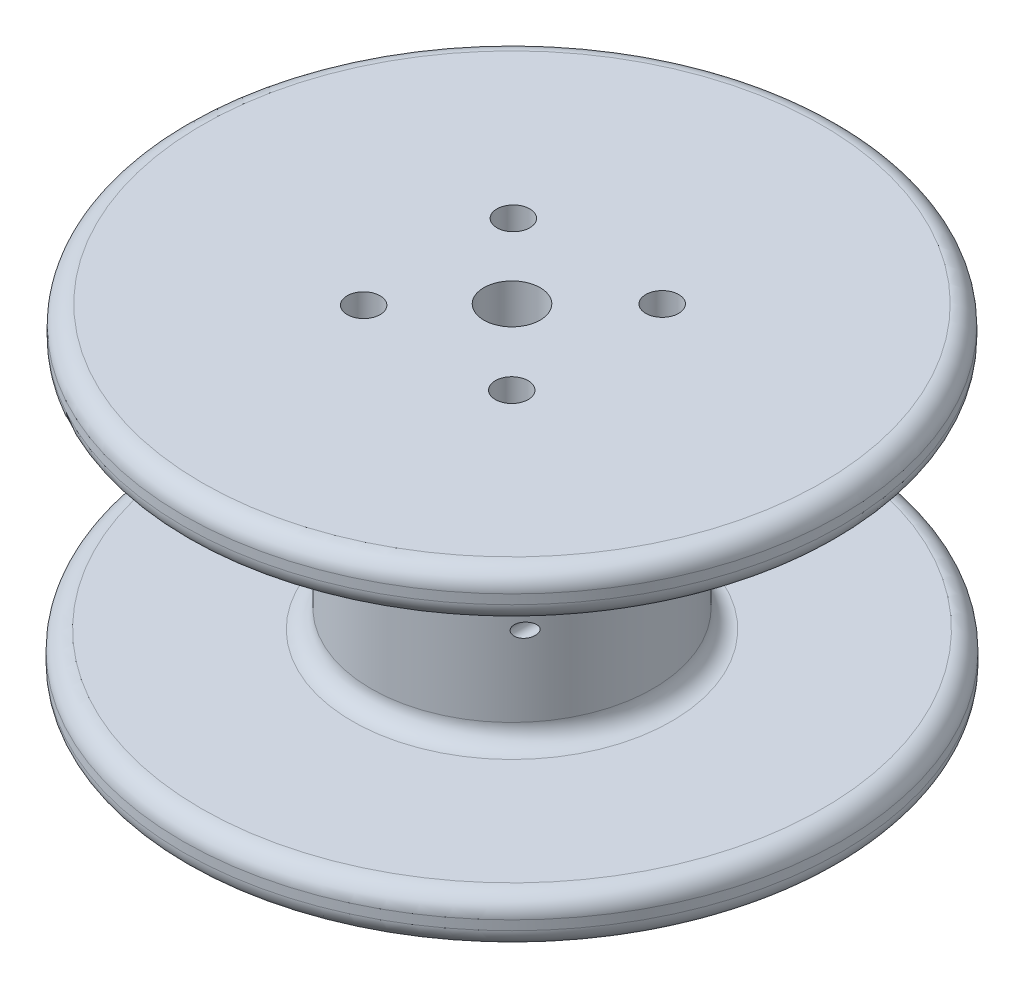
ISO-10303-21;
HEADER;
FILE_DESCRIPTION(('STEP AP214'),'2;1');
FILE_NAME('part.step','',(''),(''),'','','');
FILE_SCHEMA(('AUTOMOTIVE_DESIGN { 1 0 10303 214 1 1 1 1 }'));
ENDSEC;
DATA;
#1=APPLICATION_CONTEXT('core data for automotive mechanical design processes');
#2=APPLICATION_PROTOCOL_DEFINITION('international standard','automotive_design',2000,#1);
#3=PRODUCT_CONTEXT('',#1,'mechanical');
#4=PRODUCT('Part','Part','',(#3));
#5=PRODUCT_RELATED_PRODUCT_CATEGORY('part','',(#4));
#6=PRODUCT_DEFINITION_FORMATION('','',#4);
#7=PRODUCT_DEFINITION_CONTEXT('part definition',#1,'design');
#8=PRODUCT_DEFINITION('design','',#6,#7);
#9=PRODUCT_DEFINITION_SHAPE('','',#8);
#10=(LENGTH_UNIT() NAMED_UNIT(*) SI_UNIT(.MILLI.,.METRE.));
#11=(NAMED_UNIT(*) PLANE_ANGLE_UNIT() SI_UNIT($,.RADIAN.));
#12=(NAMED_UNIT(*) SI_UNIT($,.STERADIAN.) SOLID_ANGLE_UNIT());
#13=UNCERTAINTY_MEASURE_WITH_UNIT(LENGTH_MEASURE(1.E-05),#10,'distance_accuracy_value','');
#14=(GEOMETRIC_REPRESENTATION_CONTEXT(3) GLOBAL_UNCERTAINTY_ASSIGNED_CONTEXT((#13)) GLOBAL_UNIT_ASSIGNED_CONTEXT((#10,
#11,#12)) REPRESENTATION_CONTEXT('',''));
#15=CARTESIAN_POINT('',(0.,0.,0.));
#16=DIRECTION('',(0.,0.,1.));
#17=DIRECTION('',(1.,0.,0.));
#18=AXIS2_PLACEMENT_3D('',#15,#16,#17);
#19=CARTESIAN_POINT('',(5.3649767768147,5.8506792339153,18.7389255189844));
#20=DIRECTION('',(0.,-1.,0.));
#21=DIRECTION('',(0.,0.,-1.));
#22=AXIS2_PLACEMENT_3D('',#19,#20,#21);
#23=CYLINDRICAL_SURFACE('',#22,15.);
#24=CARTESIAN_POINT('',(5.3649767768147,-17.1493207660847,18.7389255189844));
#25=DIRECTION('',(0.,-1.,0.));
#26=DIRECTION('',(0.,0.,-1.));
#27=AXIS2_PLACEMENT_3D('',#24,#25,#26);
#28=CIRCLE('',#27,15.);
#29=CARTESIAN_POINT('',(5.3649767768147,-17.1493207660847,3.73892551898436));
#30=VERTEX_POINT('',#29);
#31=EDGE_CURVE('E184',#30,#30,#28,.F.);
#32=ORIENTED_EDGE('',*,*,#31,.T.);
#33=EDGE_LOOP('',(#32));
#34=FACE_BOUND('',#33,.T.);
#35=CARTESIAN_POINT('',(5.3649767768147,3.8506792339153,18.7389255189844));
#36=DIRECTION('',(0.,1.,0.));
#37=DIRECTION('',(0.,0.,1.));
#38=AXIS2_PLACEMENT_3D('',#35,#36,#37);
#39=CIRCLE('',#38,15.);
#40=CARTESIAN_POINT('',(5.3649767768147,3.8506792339153,33.7389255189844));
#41=VERTEX_POINT('',#40);
#42=EDGE_CURVE('E185',#41,#41,#39,.F.);
#43=ORIENTED_EDGE('',*,*,#42,.T.);
#44=EDGE_LOOP('',(#43));
#45=FACE_BOUND('',#44,.T.);
#46=CARTESIAN_POINT('',(15.8891790061136,-5.00544756114252,8.05055953363276));
#47=CARTESIAN_POINT('',(15.889181914113,-4.97207896366376,8.0505622129564));
#48=CARTESIAN_POINT('',(15.8914269025401,-4.93866534636372,8.05277146835095));
#49=CARTESIAN_POINT('',(15.900227494013,-4.87295012460581,8.06144791026443));
#50=CARTESIAN_POINT('',(15.906791922064,-4.84065093952129,8.06792381396596));
#51=CARTESIAN_POINT('',(15.9236696263763,-4.77833109047816,8.08462388748844));
#52=CARTESIAN_POINT('',(15.9339579814084,-4.74829684698665,8.09482314372935));
#53=CARTESIAN_POINT('',(15.9576416545049,-4.69084552581334,8.11839210874743));
#54=CARTESIAN_POINT('',(15.9710374993847,-4.66342889301108,8.13176235511392));
#55=CARTESIAN_POINT('',(16.0059428445912,-4.60144487306922,8.16676120387421));
#56=CARTESIAN_POINT('',(16.0285895404242,-4.56819437078488,8.18958657756171));
#57=CARTESIAN_POINT('',(16.0771619259344,-4.50728965864285,8.23891141509037));
#58=CARTESIAN_POINT('',(16.1030942650504,-4.47964710171958,8.26541834037338));
#59=CARTESIAN_POINT('',(16.1680171735549,-4.41963899082199,8.33232853820338));
#60=CARTESIAN_POINT('',(16.2080580404324,-4.38986064199597,8.37402657646971));
#61=CARTESIAN_POINT('',(16.290314662803,-4.33977614092461,8.46076442132177));
#62=CARTESIAN_POINT('',(16.3325337968752,-4.31948522632493,8.50580946996783));
#63=CARTESIAN_POINT('',(16.4337826032726,-4.2814083953156,8.61524310088077));
#64=CARTESIAN_POINT('',(16.4932052238639,-4.26738407286036,8.68057637237535));
#65=CARTESIAN_POINT('',(16.611612793469,-4.25358357386457,8.81314495350922));
#66=CARTESIAN_POINT('',(16.6705968753566,-4.25383056486331,8.88038317875259));
#67=CARTESIAN_POINT('',(16.7877923860102,-4.26790704690815,9.01640013228008));
#68=CARTESIAN_POINT('',(16.8459665081431,-4.2820004679154,9.085183399325));
#69=CARTESIAN_POINT('',(16.9589069028365,-4.32433724372592,9.22112430596214));
#70=CARTESIAN_POINT('',(17.0136796849919,-4.35255257058302,9.28828489043004));
#71=CARTESIAN_POINT('',(17.0971452947202,-4.41028731406759,9.39233460761359));
#72=CARTESIAN_POINT('',(17.1275455371407,-4.43482346703795,9.43063833024556));
#73=CARTESIAN_POINT('',(17.1857054579592,-4.49025559490618,9.50461089881965));
#74=CARTESIAN_POINT('',(17.2134683301515,-4.52114373038625,9.54028291968301));
#75=CARTESIAN_POINT('',(17.2581348689766,-4.58073883998642,9.59815160479251));
#76=CARTESIAN_POINT('',(17.2759402713793,-4.60776090672559,9.62137725891237));
#77=CARTESIAN_POINT('',(17.3087619276177,-4.6659335117058,9.66441597670165));
#78=CARTESIAN_POINT('',(17.3237829929563,-4.69707676556146,9.68423492297748));
#79=CARTESIAN_POINT('',(17.3464952401759,-4.75466851305593,9.71432173790818));
#80=CARTESIAN_POINT('',(17.3550735230231,-4.78016553523352,9.72572815792618));
#81=CARTESIAN_POINT('',(17.3696319143169,-4.83313792480478,9.74512751606485));
#82=CARTESIAN_POINT('',(17.3756145180535,-4.8606113624618,9.75312373237151));
#83=CARTESIAN_POINT('',(17.3845230739808,-4.91719727159362,9.76504314570204));
#84=CARTESIAN_POINT('',(17.3874214722968,-4.9463221090957,9.76892962499699));
#85=CARTESIAN_POINT('',(17.3897513281692,-5.00495562950559,9.77205305193482));
#86=CARTESIAN_POINT('',(17.3891846682086,-5.0344640953033,9.77129252418526));
#87=CARTESIAN_POINT('',(17.3849495493304,-5.08897805849169,9.76561714742869));
#88=CARTESIAN_POINT('',(17.3816877824554,-5.11407611387994,9.76124701783209));
#89=CARTESIAN_POINT('',(17.3728455525928,-5.16310159720335,9.74942376484463));
#90=CARTESIAN_POINT('',(17.3672639671482,-5.18702845217378,9.7419691490159));
#91=CARTESIAN_POINT('',(17.351623992164,-5.24214561867459,9.72113676401826));
#92=CARTESIAN_POINT('',(17.3406702828367,-5.27263557921504,9.70658451705739));
#93=CARTESIAN_POINT('',(17.3159016390705,-5.33031227674946,9.67383760214363));
#94=CARTESIAN_POINT('',(17.3020803628239,-5.35749147667266,9.65563486392702));
#95=CARTESIAN_POINT('',(17.2646878638864,-5.42166757946784,9.60666198925528));
#96=CARTESIAN_POINT('',(17.2397442344635,-5.45658102523069,9.5742241198599));
#97=CARTESIAN_POINT('',(17.1866114340552,-5.51976807846141,9.50578663988002));
#98=CARTESIAN_POINT('',(17.1584150285737,-5.54802644303453,9.4697791160353));
#99=CARTESIAN_POINT('',(17.0836899885476,-5.61249681636343,9.37532184064214));
#100=CARTESIAN_POINT('',(17.0355587755206,-5.64462537101157,9.31535443219502));
#101=CARTESIAN_POINT('',(16.9358009409369,-5.69658874559832,9.19312551219416));
#102=CARTESIAN_POINT('',(16.8841698283418,-5.71640742525778,9.1308611016679));
#103=CARTESIAN_POINT('',(16.7766264226144,-5.74491693873943,9.00334855132304));
#104=CARTESIAN_POINT('',(16.7206262925954,-5.75316563559109,8.9380756797754));
#105=CARTESIAN_POINT('',(16.6073241736508,-5.75690945968884,8.80831480522619));
#106=CARTESIAN_POINT('',(16.5500230519735,-5.75241284898085,8.74382632097239));
#107=CARTESIAN_POINT('',(16.4450433491691,-5.73151981688938,8.62768381471077));
#108=CARTESIAN_POINT('',(16.397343793203,-5.71721893036029,8.57567392513898));
#109=CARTESIAN_POINT('',(16.3032771763167,-5.67795214676981,8.47450535630398));
#110=CARTESIAN_POINT('',(16.2569082711289,-5.6530018556048,8.4253426240042));
#111=CARTESIAN_POINT('',(16.1807692853111,-5.60027697964653,8.34562374689932));
#112=CARTESIAN_POINT('',(16.1501543589533,-5.57553373688251,8.31387305627028));
#113=CARTESIAN_POINT('',(16.091648401915,-5.51959070738875,8.25368521187922));
#114=CARTESIAN_POINT('',(16.0637534433809,-5.48840044016758,8.22524326819734));
#115=CARTESIAN_POINT('',(16.0182688628729,-5.42741652550454,8.17918302984812));
#116=CARTESIAN_POINT('',(15.9997985065512,-5.39901961302501,8.16059235628507));
#117=CARTESIAN_POINT('',(15.9662267182574,-5.33836202856874,8.12694816063829));
#118=CARTESIAN_POINT('',(15.9511222683046,-5.30610485804492,8.11189146922096));
#119=CARTESIAN_POINT('',(15.9274239737102,-5.2438286197896,8.08834138616769));
#120=CARTESIAN_POINT('',(15.9181673020813,-5.21431734357138,8.07917518187886));
#121=CARTESIAN_POINT('',(15.9032877950989,-5.15355665822734,8.06446476994967));
#122=CARTESIAN_POINT('',(15.8976565652987,-5.12231144760208,8.05891219488727));
#123=CARTESIAN_POINT('',(15.8924228488499,-5.07656389561166,8.05375433122965));
#124=CARTESIAN_POINT('',(15.8912090277514,-5.06239826286872,8.05255868748308));
#125=CARTESIAN_POINT('',(15.8895863947099,-5.03397369725734,8.05096062721514));
#126=CARTESIAN_POINT('',(15.8891777627601,-5.01971474424252,8.05055838805267));
#127=CARTESIAN_POINT('',(15.8891790061136,-5.00544756114252,8.05055953363276));
#128=B_SPLINE_CURVE_WITH_KNOTS('',3,(#46,#47,#48,#49,#50,#51,#52,#53,#54,#55,#56,#57,#58,#59,
#60,#61,#62,#63,#64,#65,#66,#67,#68,#69,#70,#71,#72,#73,#74,#75,#76,#77,#78,#79,#80,#81,#82,#83,
#84,#85,#86,#87,#88,#89,#90,#91,#92,#93,#94,#95,#96,#97,#98,#99,#100,#101,#102,#103,#104,#105,
#106,#107,#108,#109,#110,#111,#112,#113,#114,#115,#116,#117,#118,#119,#120,#121,#122,#123,#124,
#125,#126,#127),.UNSPECIFIED.,.T.,.F.,(4,2,2,2,2,2,2,2,2,2,2,2,2,2,2,2,2,2,2,2,2,2,2,2,2,2,2,2,
2,2,2,2,2,2,2,2,2,2,2,2,4),(0.,0.100041881431961,0.200288794759234,0.299876878229037,
0.399481857307535,0.537478203062803,0.675758423422499,0.869774809768873,1.06410174194843,
1.33095859465769,1.5982486653789,1.87073445139912,2.14268156289555,2.3064530726867,
2.47002366094672,2.58918193421083,2.7081323349891,2.79547495702423,2.88273342740119,
2.9707650715562,3.05874889448211,3.13546055551593,3.21220937720043,3.31816084621014,
3.42434918026893,3.58481892527648,3.7456527136925,3.99431490286966,4.24330244477831,
4.50156724296353,4.75966466131022,4.97499003522363,5.19000094364641,5.34125498321252,
5.49228726030966,5.60779897244409,5.723206692529,5.81958756312064,5.91574446050248,
5.95850912521557,6.00128334852439),.UNSPECIFIED.);
#129=CARTESIAN_POINT('',(15.8891790061136,-5.00544756114252,8.05055953363276));
#130=VERTEX_POINT('',#129);
#131=EDGE_CURVE('E59',#130,#130,#128,.T.);
#132=ORIENTED_EDGE('',*,*,#131,.F.);
#133=EDGE_LOOP('',(#132));
#134=FACE_BOUND('',#133,.T.);
#135=CARTESIAN_POINT('',(15.8891790061136,-5.00544756114252,29.427291504336));
#136=CARTESIAN_POINT('',(15.889181914113,-5.03881615862127,29.4272888250123));
#137=CARTESIAN_POINT('',(15.8914269025401,-5.07222977592131,29.4250795696178));
#138=CARTESIAN_POINT('',(15.900227494013,-5.13794499767923,29.4164031277043));
#139=CARTESIAN_POINT('',(15.906791922064,-5.17024418276374,29.4099272240027));
#140=CARTESIAN_POINT('',(15.9236696263763,-5.23256403180688,29.3932271504803));
#141=CARTESIAN_POINT('',(15.9339579814084,-5.26259827529839,29.3830278942394));
#142=CARTESIAN_POINT('',(15.9576416545049,-5.3200495964717,29.3594589292213));
#143=CARTESIAN_POINT('',(15.9710374993847,-5.34746622927396,29.3460886828548));
#144=CARTESIAN_POINT('',(16.0059428445912,-5.40945024921582,29.3110898340945));
#145=CARTESIAN_POINT('',(16.0285895404242,-5.44270075150015,29.288264460407));
#146=CARTESIAN_POINT('',(16.0771619259344,-5.50360546364219,29.2389396228783));
#147=CARTESIAN_POINT('',(16.1030942650504,-5.53124802056546,29.2124326975953));
#148=CARTESIAN_POINT('',(16.1680171735549,-5.59125613146305,29.1455224997653));
#149=CARTESIAN_POINT('',(16.2080580404324,-5.62103448028906,29.103824461499));
#150=CARTESIAN_POINT('',(16.290314662803,-5.67111898136042,29.0170866166469));
#151=CARTESIAN_POINT('',(16.3325337968752,-5.6914098959601,28.9720415680009));
#152=CARTESIAN_POINT('',(16.4337826032726,-5.72948672696944,28.8626079370879));
#153=CARTESIAN_POINT('',(16.4932052238639,-5.74351104942468,28.7972746655934));
#154=CARTESIAN_POINT('',(16.611612793469,-5.75731154842046,28.6647060844595));
#155=CARTESIAN_POINT('',(16.6705968753566,-5.75706455742172,28.5974678592161));
#156=CARTESIAN_POINT('',(16.7877923860102,-5.74298807537688,28.4614509056886));
#157=CARTESIAN_POINT('',(16.8459665081431,-5.72889465436963,28.3926676386437));
#158=CARTESIAN_POINT('',(16.9589069028365,-5.68655787855912,28.2567267320066));
#159=CARTESIAN_POINT('',(17.0136796849919,-5.65834255170201,28.1895661475387));
#160=CARTESIAN_POINT('',(17.0971452947202,-5.60060780821744,28.0855164303551));
#161=CARTESIAN_POINT('',(17.1275455371407,-5.57607165524708,28.0472127077231));
#162=CARTESIAN_POINT('',(17.1857054579592,-5.52063952737885,27.9732401391491));
#163=CARTESIAN_POINT('',(17.2134683301515,-5.48975139189878,27.9375681182857));
#164=CARTESIAN_POINT('',(17.2581348689766,-5.43015628229861,27.8796994331762));
#165=CARTESIAN_POINT('',(17.2759402713793,-5.40313421555944,27.8564737790563));
#166=CARTESIAN_POINT('',(17.3087619276177,-5.34496161057923,27.8134350612671));
#167=CARTESIAN_POINT('',(17.3237829929563,-5.31381835672358,27.7936161149912));
#168=CARTESIAN_POINT('',(17.3464952401759,-5.2562266092291,27.7635293000605));
#169=CARTESIAN_POINT('',(17.3550735230231,-5.23072958705152,27.7521228800425));
#170=CARTESIAN_POINT('',(17.3696319143169,-5.17775719748025,27.7327235219039));
#171=CARTESIAN_POINT('',(17.3756145180535,-5.15028375982323,27.7247273055972));
#172=CARTESIAN_POINT('',(17.3845230739808,-5.09369785069141,27.7128078922667));
#173=CARTESIAN_POINT('',(17.3874214722968,-5.06457301318933,27.7089214129717));
#174=CARTESIAN_POINT('',(17.3897513281692,-5.00593949277944,27.7057979860339));
#175=CARTESIAN_POINT('',(17.3891846682086,-4.97643102698173,27.7065585137834));
#176=CARTESIAN_POINT('',(17.3849495493304,-4.92191706379334,27.71223389054));
#177=CARTESIAN_POINT('',(17.3816877824554,-4.8968190084051,27.7166040201366));
#178=CARTESIAN_POINT('',(17.3728455525928,-4.84779352508168,27.7284272731241));
#179=CARTESIAN_POINT('',(17.3672639671482,-4.82386667011125,27.7358818889528));
#180=CARTESIAN_POINT('',(17.351623992164,-4.76874950361045,27.7567142739504));
#181=CARTESIAN_POINT('',(17.3406702828367,-4.73825954307,27.7712665209113));
#182=CARTESIAN_POINT('',(17.3159016390705,-4.68058284553557,27.8040134358251));
#183=CARTESIAN_POINT('',(17.3020803628239,-4.65340364561237,27.8222161740417));
#184=CARTESIAN_POINT('',(17.2646878638864,-4.58922754281719,27.8711890487134));
#185=CARTESIAN_POINT('',(17.2397442344635,-4.55431409705433,27.9036269181088));
#186=CARTESIAN_POINT('',(17.1866114340552,-4.49112704382362,27.9720643980887));
#187=CARTESIAN_POINT('',(17.1584150285737,-4.4628686792505,28.0080719219334));
#188=CARTESIAN_POINT('',(17.0836899885475,-4.3983983059216,28.1025291973266));
#189=CARTESIAN_POINT('',(17.0355587755206,-4.36626975127346,28.1624966057737));
#190=CARTESIAN_POINT('',(16.9358009409369,-4.3143063766867,28.2847255257746));
#191=CARTESIAN_POINT('',(16.8841698283418,-4.29448769702725,28.3469899363008));
#192=CARTESIAN_POINT('',(16.7766264226144,-4.2659781835456,28.4745024866457));
#193=CARTESIAN_POINT('',(16.7206262925953,-4.25772948669395,28.5397753581933));
#194=CARTESIAN_POINT('',(16.6073241736508,-4.2539856625962,28.6695362327425));
#195=CARTESIAN_POINT('',(16.5500230519735,-4.25848227330419,28.7340247169963));
#196=CARTESIAN_POINT('',(16.4450433491691,-4.27937530539566,28.850167223258));
#197=CARTESIAN_POINT('',(16.397343793203,-4.29367619192475,28.9021771128298));
#198=CARTESIAN_POINT('',(16.3032771763167,-4.33294297551523,29.0033456816647));
#199=CARTESIAN_POINT('',(16.2569082711289,-4.35789326668024,29.0525084139645));
#200=CARTESIAN_POINT('',(16.1807692853111,-4.41061814263852,29.1322272910694));
#201=CARTESIAN_POINT('',(16.1501543589532,-4.43536138540254,29.1639779816984));
#202=CARTESIAN_POINT('',(16.0916484019149,-4.49130441489629,29.2241658260895));
#203=CARTESIAN_POINT('',(16.0637534433809,-4.52249468211746,29.2526077697714));
#204=CARTESIAN_POINT('',(16.0182688628729,-4.58347859678051,29.2986680081206));
#205=CARTESIAN_POINT('',(15.9997985065512,-4.61187550926004,29.3172586816836));
#206=CARTESIAN_POINT('',(15.9662267182574,-4.67253309371631,29.3509028773304));
#207=CARTESIAN_POINT('',(15.9511222683045,-4.70479026424013,29.3659595687478));
#208=CARTESIAN_POINT('',(15.9274239737102,-4.76706650249545,29.389509651801));
#209=CARTESIAN_POINT('',(15.9181673020813,-4.79657777871367,29.3986758560899));
#210=CARTESIAN_POINT('',(15.9032877950989,-4.85733846405771,29.413386268019));
#211=CARTESIAN_POINT('',(15.8976565652987,-4.88858367468297,29.4189388430814));
#212=CARTESIAN_POINT('',(15.8924228488499,-4.93433122667338,29.4240967067391));
#213=CARTESIAN_POINT('',(15.8912090277514,-4.94849685941632,29.4252923504856));
#214=CARTESIAN_POINT('',(15.8895863947099,-4.97692142502769,29.4268904107536));
#215=CARTESIAN_POINT('',(15.8891777627601,-4.99118037804252,29.427292649916));
#216=CARTESIAN_POINT('',(15.8891790061136,-5.00544756114252,29.427291504336));
#217=B_SPLINE_CURVE_WITH_KNOTS('',3,(#135,#136,#137,#138,#139,#140,#141,#142,#143,#144,#145,
#146,#147,#148,#149,#150,#151,#152,#153,#154,#155,#156,#157,#158,#159,#160,#161,#162,#163,#164,
#165,#166,#167,#168,#169,#170,#171,#172,#173,#174,#175,#176,#177,#178,#179,#180,#181,#182,#183,
#184,#185,#186,#187,#188,#189,#190,#191,#192,#193,#194,#195,#196,#197,#198,#199,#200,#201,#202,
#203,#204,#205,#206,#207,#208,#209,#210,#211,#212,#213,#214,#215,#216),.UNSPECIFIED.,.T.,.F.,(4,
2,2,2,2,2,2,2,2,2,2,2,2,2,2,2,2,2,2,2,2,2,2,2,2,2,2,2,2,2,2,2,2,2,2,2,2,2,2,2,4),(0.,
0.100041881431961,0.200288794759234,0.299876878229037,0.399481857307534,0.537478203062804,
0.675758423422505,0.869774809768881,1.06410174194844,1.33095859465769,1.5982486653789,
1.87073445139913,2.14268156289556,2.30645307268671,2.47002366094672,2.58918193421083,
2.7081323349891,2.79547495702423,2.88273342740119,2.9707650715562,3.05874889448211,
3.13546055551593,3.21220937720042,3.31816084621014,3.42434918026893,3.58481892527649,
3.74565271369252,3.99431490286968,4.24330244477834,4.50156724296356,4.75966466131025,
4.97499003522366,5.19000094364643,5.34125498321253,5.49228726030968,5.60779897244411,
5.72320669252901,5.81958756312065,5.91574446050249,5.95850912521557,6.00128334852439),.UNSPECIFIED.);
#218=CARTESIAN_POINT('',(15.8891790061136,-5.00544756114252,29.427291504336));
#219=VERTEX_POINT('',#218);
#220=EDGE_CURVE('E66',#219,#219,#217,.T.);
#221=ORIENTED_EDGE('',*,*,#220,.F.);
#222=EDGE_LOOP('',(#221));
#223=FACE_BOUND('',#222,.T.);
#224=CARTESIAN_POINT('',(15.8716682010047,-8.65951692424716,8.03334588419328));
#225=CARTESIAN_POINT('',(15.8716710678377,-8.6263145797545,8.03334851759768));
#226=CARTESIAN_POINT('',(15.8739070704178,-8.5930666360293,8.03554174260798));
#227=CARTESIAN_POINT('',(15.8826731417926,-8.52767519689502,8.0441558368746));
#228=CARTESIAN_POINT('',(15.8892121459111,-8.4955341464518,8.05058550327588));
#229=CARTESIAN_POINT('',(15.9060263257592,-8.43351731888683,8.06716789084443));
#230=CARTESIAN_POINT('',(15.9162767114848,-8.40362806504461,8.07729591275694));
#231=CARTESIAN_POINT('',(15.9398753650106,-8.34645366887596,8.10070216858523));
#232=CARTESIAN_POINT('',(15.9532241274748,-8.31916894335213,8.11398090552867));
#233=CARTESIAN_POINT('',(15.9879908676796,-8.25751834934915,8.1487234928852));
#234=CARTESIAN_POINT('',(16.0105388325237,-8.22445812070676,8.17137217936095));
#235=CARTESIAN_POINT('',(16.0589035332562,-8.1639019836219,8.22031711049249));
#236=CARTESIAN_POINT('',(16.0847268846604,-8.1364176376482,8.24662074786145));
#237=CARTESIAN_POINT('',(16.1493243847669,-8.07681210125354,8.31296054940817));
#238=CARTESIAN_POINT('',(16.1891402248506,-8.04724915657147,8.35427460496714));
#239=CARTESIAN_POINT('',(16.2709427929719,-7.99753033484997,8.44021419273184));
#240=CARTESIAN_POINT('',(16.3129328792454,-7.97738952317066,8.48484489691285));
#241=CARTESIAN_POINT('',(16.4135081293024,-7.93966043782677,8.59312735980029));
#242=CARTESIAN_POINT('',(16.4724839800373,-7.92577514494572,8.65770595053237));
#243=CARTESIAN_POINT('',(16.5900173438717,-7.91212439159487,8.78873699408738));
#244=CARTESIAN_POINT('',(16.6485740310605,-7.91238168876961,8.85519229510768));
#245=CARTESIAN_POINT('',(16.7649133269299,-7.92636606523868,8.98959232352416));
#246=CARTESIAN_POINT('',(16.8226598559689,-7.94035002241876,9.05754127884149));
#247=CARTESIAN_POINT('',(16.9347807280569,-7.98234711994015,9.19181940655473));
#248=CARTESIAN_POINT('',(16.9891614559275,-8.01033272200343,9.25815149147759));
#249=CARTESIAN_POINT('',(17.0721540308452,-8.067664072133,9.36105223776033));
#250=CARTESIAN_POINT('',(17.1024520332213,-8.09209547126634,9.39901771825025));
#251=CARTESIAN_POINT('',(17.1604044392218,-8.14729989292697,9.47231617463796));
#252=CARTESIAN_POINT('',(17.1880620980925,-8.1780649550168,9.50765237995656));
#253=CARTESIAN_POINT('',(17.232525367821,-8.23739645502461,9.56492796133243));
#254=CARTESIAN_POINT('',(17.2502357602132,-8.26428219408979,9.58789591751236));
#255=CARTESIAN_POINT('',(17.2828715462333,-8.32214742083026,9.63044057496949));
#256=CARTESIAN_POINT('',(17.2978017075277,-8.35311974182022,9.65002307756768));
#257=CARTESIAN_POINT('',(17.3204001022689,-8.41045728850741,9.67978054536476));
#258=CARTESIAN_POINT('',(17.3289453817668,-8.4358891697118,9.69107498461167));
#259=CARTESIAN_POINT('',(17.3434322720783,-8.48871619078682,9.71026288835507));
#260=CARTESIAN_POINT('',(17.3493763775181,-8.51610942017394,9.71815961126996));
#261=CARTESIAN_POINT('',(17.3582055966656,-8.57251292319687,9.72990120697411));
#262=CARTESIAN_POINT('',(17.3610634897355,-8.60153524844719,9.73371002232367));
#263=CARTESIAN_POINT('',(17.3633174159742,-8.65994918259956,9.73671321071551));
#264=CARTESIAN_POINT('',(17.3627152633979,-8.68934058990969,9.73591000204601));
#265=CARTESIAN_POINT('',(17.35841874233,-8.74366637058052,9.73018761187706));
#266=CARTESIAN_POINT('',(17.355126414181,-8.76869308808019,9.72580360376398));
#267=CARTESIAN_POINT('',(17.3462231444987,-8.81757356951706,9.71397177273353));
#268=CARTESIAN_POINT('',(17.3406110910235,-8.84142676479139,9.70652248050438));
#269=CARTESIAN_POINT('',(17.3248948654704,-8.89638235448702,9.68571695349661));
#270=CARTESIAN_POINT('',(17.313893830908,-8.92678329792193,9.67119150259129));
#271=CARTESIAN_POINT('',(17.2890277477577,-8.98428121197733,9.638517151342));
#272=CARTESIAN_POINT('',(17.2751563556307,-9.01137064951147,9.62036022840767));
#273=CARTESIAN_POINT('',(17.2376780689019,-9.07524470113489,9.5715748157188));
#274=CARTESIAN_POINT('',(17.2127064530501,-9.10995872051207,9.5392980733599));
#275=CARTESIAN_POINT('',(17.1595240611409,-9.17275909876354,9.47121043213121));
#276=CARTESIAN_POINT('',(17.1313061105039,-9.20083034169902,9.43539173084211));
#277=CARTESIAN_POINT('',(17.0567105024135,-9.26467451647757,9.34165981513194));
#278=CARTESIAN_POINT('',(17.0087551887204,-9.29642036164917,9.28226060812824));
#279=CARTESIAN_POINT('',(16.9093864134457,-9.34769070086782,9.16120220396752));
#280=CARTESIAN_POINT('',(16.8579685409886,-9.36719926706193,9.09954017152752));
#281=CARTESIAN_POINT('',(16.7509416789843,-9.39511879457892,8.97332825457364));
#282=CARTESIAN_POINT('',(16.6952482623556,-9.40310003757046,8.90875494141371));
#283=CARTESIAN_POINT('',(16.5826028729049,-9.40637874120166,8.78040451109042));
#284=CARTESIAN_POINT('',(16.5256517528084,-9.40168454890234,8.71662689773055));
#285=CARTESIAN_POINT('',(16.421486372008,-9.38052412087039,8.6019358095558));
#286=CARTESIAN_POINT('',(16.3742435338999,-9.36616783094998,8.55066106077148));
#287=CARTESIAN_POINT('',(16.2811151997811,-9.32691393886408,8.45094501431214));
#288=CARTESIAN_POINT('',(16.2352278244457,-9.30203174293325,8.40249969281924));
#289=CARTESIAN_POINT('',(16.1598423212096,-9.24950685956359,8.32389202016051));
#290=CARTESIAN_POINT('',(16.1295016938312,-9.22484222419516,8.29255116328844));
#291=CARTESIAN_POINT('',(16.0715492729396,-9.16912110865915,8.23316452028735));
#292=CARTESIAN_POINT('',(16.0439335464053,-9.13807404645291,8.20511397366212));
#293=CARTESIAN_POINT('',(15.9989077273314,-9.07737890142124,8.15968695450652));
#294=CARTESIAN_POINT('',(15.9806220171831,-9.04910527503996,8.14134902199991));
#295=CARTESIAN_POINT('',(15.9474140821619,-8.98873956931721,8.10818846103442));
#296=CARTESIAN_POINT('',(15.9324888921837,-8.95665089463645,8.09336273302652));
#297=CARTESIAN_POINT('',(15.9090835805659,-8.89467904196814,8.07018431821512));
#298=CARTESIAN_POINT('',(15.899948946529,-8.86529162834726,8.06116989711985));
#299=CARTESIAN_POINT('',(15.8853051604645,-8.80480922909776,8.04674153782215));
#300=CARTESIAN_POINT('',(15.8797875595319,-8.77371840797872,8.04131920865876));
#301=CARTESIAN_POINT('',(15.8747423632315,-8.72854635706486,8.03636363296824));
#302=CARTESIAN_POINT('',(15.8735919639897,-8.71479374055291,8.03523418561465));
#303=CARTESIAN_POINT('',(15.8720542013749,-8.68720237983337,8.03372467989746));
#304=CARTESIAN_POINT('',(15.8716670054217,-8.67336361739615,8.03334478595932));
#305=CARTESIAN_POINT('',(15.8716682010047,-8.65951692424716,8.03334588419328));
#306=B_SPLINE_CURVE_WITH_KNOTS('',3,(#224,#225,#226,#227,#228,#229,#230,#231,#232,#233,#234,
#235,#236,#237,#238,#239,#240,#241,#242,#243,#244,#245,#246,#247,#248,#249,#250,#251,#252,#253,
#254,#255,#256,#257,#258,#259,#260,#261,#262,#263,#264,#265,#266,#267,#268,#269,#270,#271,#272,
#273,#274,#275,#276,#277,#278,#279,#280,#281,#282,#283,#284,#285,#286,#287,#288,#289,#290,#291,
#292,#293,#294,#295,#296,#297,#298,#299,#300,#301,#302,#303,#304,#305),.UNSPECIFIED.,.T.,.F.,(4,
2,2,2,2,2,2,2,2,2,2,2,2,2,2,2,2,2,2,2,2,2,2,2,2,2,2,2,2,2,2,2,2,2,2,2,2,2,2,2,4),(0.,
0.0995449902599458,0.199297344017285,0.298395340049599,0.397509168238395,0.534693436350585,
0.672159333581013,0.864734126563084,1.05761579011987,1.32187764073769,1.58656474253128,
1.85630144713781,2.12550970991841,2.28825875064371,2.4508044762105,2.56910867920487,
2.68720810194419,2.77422024345335,2.86114875310293,2.94883786974885,3.0364810113116,
3.1130038232585,3.18956335842055,3.29529797623335,3.40126881401606,3.56110216426185,
3.7212957983608,3.96799699989013,4.21501864121398,4.47103024114252,4.72687329276007,
4.93973943345119,5.15229508490578,5.30216712602352,5.4518195820451,5.5664328023714,
5.68094449562876,5.77675342916419,5.87233776078283,5.91384286201398,5.95535706698087),.UNSPECIFIED.);
#307=CARTESIAN_POINT('',(15.8716682010047,-8.65951692424716,8.03334588419328));
#308=VERTEX_POINT('',#307);
#309=EDGE_CURVE('E252',#308,#308,#306,.T.);
#310=ORIENTED_EDGE('',*,*,#309,.F.);
#311=EDGE_LOOP('',(#310));
#312=FACE_BOUND('',#311,.T.);
#313=CARTESIAN_POINT('',(15.8716682010047,-8.65951692424716,29.4445051537754));
#314=CARTESIAN_POINT('',(15.8716710678377,-8.69271926873981,29.444502520371));
#315=CARTESIAN_POINT('',(15.8739070704178,-8.72596721246501,29.4423092953607));
#316=CARTESIAN_POINT('',(15.8826731417926,-8.79135865159929,29.4336952010941));
#317=CARTESIAN_POINT('',(15.8892121459111,-8.82349970204251,29.4272655346928));
#318=CARTESIAN_POINT('',(15.9060263257592,-8.88551652960748,29.4106831471243));
#319=CARTESIAN_POINT('',(15.9162767114848,-8.9154057834497,29.4005551252118));
#320=CARTESIAN_POINT('',(15.9398753650106,-8.97258017961835,29.3771488693835));
#321=CARTESIAN_POINT('',(15.9532241274748,-8.99986490514218,29.36387013244));
#322=CARTESIAN_POINT('',(15.9879908676796,-9.06151549914516,29.3291275450835));
#323=CARTESIAN_POINT('',(16.0105388325237,-9.09457572778756,29.3064788586078));
#324=CARTESIAN_POINT('',(16.0589035332562,-9.15513186487241,29.2575339274762));
#325=CARTESIAN_POINT('',(16.0847268846604,-9.18261621084611,29.2312302901073));
#326=CARTESIAN_POINT('',(16.1493243847669,-9.24222174724077,29.1648904885605));
#327=CARTESIAN_POINT('',(16.1891402248506,-9.27178469192284,29.1235764330016));
#328=CARTESIAN_POINT('',(16.2709427929719,-9.32150351364434,29.0376368452369));
#329=CARTESIAN_POINT('',(16.3129328792454,-9.34164432532365,28.9930061410559));
#330=CARTESIAN_POINT('',(16.4135081293024,-9.37937341066754,28.8847236781684));
#331=CARTESIAN_POINT('',(16.4724839800373,-9.3932587035486,28.8201450874363));
#332=CARTESIAN_POINT('',(16.5900173438717,-9.40690945689944,28.6891140438813));
#333=CARTESIAN_POINT('',(16.6485740310605,-9.4066521597247,28.622658742861));
#334=CARTESIAN_POINT('',(16.7649133269299,-9.39266778325564,28.4882587144446));
#335=CARTESIAN_POINT('',(16.8226598559689,-9.37868382607555,28.4203097591272));
#336=CARTESIAN_POINT('',(16.9347807280568,-9.33668672855417,28.286031631414));
#337=CARTESIAN_POINT('',(16.9891614559275,-9.30870112649089,28.2196995464911));
#338=CARTESIAN_POINT('',(17.0721540308452,-9.25136977636132,28.1167988002084));
#339=CARTESIAN_POINT('',(17.1024520332213,-9.22693837722798,28.0788333197185));
#340=CARTESIAN_POINT('',(17.1604044392217,-9.17173395556735,28.0055348633308));
#341=CARTESIAN_POINT('',(17.1880620980925,-9.14096889347752,27.9701986580122));
#342=CARTESIAN_POINT('',(17.232525367821,-9.08163739346971,27.9129230766363));
#343=CARTESIAN_POINT('',(17.2502357602132,-9.05475165440453,27.8899551204563));
#344=CARTESIAN_POINT('',(17.2828715462333,-8.99688642766406,27.8474104629992));
#345=CARTESIAN_POINT('',(17.2978017075277,-8.9659141066741,27.827827960401));
#346=CARTESIAN_POINT('',(17.3204001022689,-8.9085765599869,27.798070492604));
#347=CARTESIAN_POINT('',(17.3289453817668,-8.88314467878252,27.786776053357));
#348=CARTESIAN_POINT('',(17.3434322720783,-8.8303176577075,27.7675881496136));
#349=CARTESIAN_POINT('',(17.3493763775181,-8.80292442832038,27.7596914266988));
#350=CARTESIAN_POINT('',(17.3582055966656,-8.74652092529745,27.7479498309946));
#351=CARTESIAN_POINT('',(17.3610634897355,-8.71749860004713,27.744141015645));
#352=CARTESIAN_POINT('',(17.3633174159742,-8.65908466589476,27.7411378272532));
#353=CARTESIAN_POINT('',(17.3627152633979,-8.62969325858463,27.7419410359227));
#354=CARTESIAN_POINT('',(17.35841874233,-8.57536747791379,27.7476634260917));
#355=CARTESIAN_POINT('',(17.355126414181,-8.55034076041412,27.7520474342047));
#356=CARTESIAN_POINT('',(17.3462231444987,-8.50146027897725,27.7638792652352));
#357=CARTESIAN_POINT('',(17.3406110910235,-8.47760708370293,27.7713285574643));
#358=CARTESIAN_POINT('',(17.3248948654704,-8.42265149400729,27.7921340844721));
#359=CARTESIAN_POINT('',(17.313893830908,-8.39225055057239,27.8066595353774));
#360=CARTESIAN_POINT('',(17.2890277477577,-8.33475263651699,27.8393338866267));
#361=CARTESIAN_POINT('',(17.2751563556307,-8.30766319898284,27.857490809561));
#362=CARTESIAN_POINT('',(17.2376780689019,-8.24378914735942,27.9062762222499));
#363=CARTESIAN_POINT('',(17.2127064530501,-8.20907512798224,27.9385529646088));
#364=CARTESIAN_POINT('',(17.1595240611408,-8.14627474973077,28.0066406058375));
#365=CARTESIAN_POINT('',(17.1313061105039,-8.11820350679529,28.0424593071266));
#366=CARTESIAN_POINT('',(17.0567105024135,-8.05435933201674,28.1361912228368));
#367=CARTESIAN_POINT('',(17.0087551887204,-8.02261348684514,28.1955904298405));
#368=CARTESIAN_POINT('',(16.9093864134457,-7.97134314762649,28.3166488340012));
#369=CARTESIAN_POINT('',(16.8579685409886,-7.95183458143238,28.3783108664412));
#370=CARTESIAN_POINT('',(16.7509416789843,-7.9239150539154,28.5045227833951));
#371=CARTESIAN_POINT('',(16.6952482623556,-7.91593381092385,28.569096096555));
#372=CARTESIAN_POINT('',(16.5826028729049,-7.91265510729265,28.6974465268783));
#373=CARTESIAN_POINT('',(16.5256517528084,-7.91734929959198,28.7612241402382));
#374=CARTESIAN_POINT('',(16.421486372008,-7.93850972762393,28.8759152284129));
#375=CARTESIAN_POINT('',(16.3742435338999,-7.95286601754433,28.9271899771972));
#376=CARTESIAN_POINT('',(16.2811151997811,-7.99211990963024,29.0269060236566));
#377=CARTESIAN_POINT('',(16.2352278244456,-8.01700210556107,29.0753513451495));
#378=CARTESIAN_POINT('',(16.1598423212096,-8.06952698893073,29.1539590178082));
#379=CARTESIAN_POINT('',(16.1295016938312,-8.09419162429916,29.1852998746803));
#380=CARTESIAN_POINT('',(16.0715492729396,-8.14991273983517,29.2446865176814));
#381=CARTESIAN_POINT('',(16.0439335464053,-8.18095980204142,29.2727370643066));
#382=CARTESIAN_POINT('',(15.9989077273314,-8.24165494707307,29.3181640834622));
#383=CARTESIAN_POINT('',(15.9806220171831,-8.26992857345437,29.3365020159688));
#384=CARTESIAN_POINT('',(15.9474140821619,-8.33029427917711,29.3696625769343));
#385=CARTESIAN_POINT('',(15.9324888921837,-8.36238295385786,29.3844883049422));
#386=CARTESIAN_POINT('',(15.9090835805659,-8.42435480652617,29.4076667197536));
#387=CARTESIAN_POINT('',(15.899948946529,-8.45374222014705,29.4166811408489));
#388=CARTESIAN_POINT('',(15.8853051604645,-8.51422461939656,29.4311095001466));
#389=CARTESIAN_POINT('',(15.8797875595319,-8.5453154405156,29.43653182931));
#390=CARTESIAN_POINT('',(15.8747423632315,-8.59048749142945,29.4414874050005));
#391=CARTESIAN_POINT('',(15.8735919639897,-8.6042401079414,29.4426168523541));
#392=CARTESIAN_POINT('',(15.8720542013749,-8.63183146866094,29.4441263580713));
#393=CARTESIAN_POINT('',(15.8716670054217,-8.64567023109816,29.4445062520094));
#394=CARTESIAN_POINT('',(15.8716682010047,-8.65951692424716,29.4445051537754));
#395=B_SPLINE_CURVE_WITH_KNOTS('',3,(#313,#314,#315,#316,#317,#318,#319,#320,#321,#322,#323,
#324,#325,#326,#327,#328,#329,#330,#331,#332,#333,#334,#335,#336,#337,#338,#339,#340,#341,#342,
#343,#344,#345,#346,#347,#348,#349,#350,#351,#352,#353,#354,#355,#356,#357,#358,#359,#360,#361,
#362,#363,#364,#365,#366,#367,#368,#369,#370,#371,#372,#373,#374,#375,#376,#377,#378,#379,#380,
#381,#382,#383,#384,#385,#386,#387,#388,#389,#390,#391,#392,#393,#394),.UNSPECIFIED.,.T.,.F.,(4,
2,2,2,2,2,2,2,2,2,2,2,2,2,2,2,2,2,2,2,2,2,2,2,2,2,2,2,2,2,2,2,2,2,2,2,2,2,2,2,4),(0.,
0.0995449902599459,0.199297344017284,0.298395340049593,0.397509168238396,0.534693436350588,
0.672159333581013,0.864734126563082,1.05761579011986,1.32187764073769,1.58656474253127,
1.8563014471378,2.12550970991839,2.2882587506437,2.45080447621049,2.56910867920487,
2.68720810194418,2.77422024345335,2.86114875310293,2.94883786974885,3.0364810113116,
3.11300382325851,3.18956335842056,3.29529797623335,3.40126881401607,3.56110216426186,
3.72129579836081,3.96799699989014,4.21501864121399,4.47103024114253,4.72687329276008,
4.9397394334512,5.1522950849058,5.30216712602353,5.45181958204512,5.56643280237141,
5.68094449562876,5.77675342916419,5.87233776078284,5.91384286201398,5.95535706698086),.UNSPECIFIED.);
#396=CARTESIAN_POINT('',(15.8716682010047,-8.65951692424716,29.4445051537754));
#397=VERTEX_POINT('',#396);
#398=EDGE_CURVE('E41',#397,#397,#395,.T.);
#399=ORIENTED_EDGE('',*,*,#398,.F.);
#400=EDGE_LOOP('',(#399));
#401=FACE_BOUND('',#400,.T.);
#402=ADVANCED_FACE('F37',(#34,#45,#134,#223,#312,#401),#23,.T.);
#403=CARTESIAN_POINT('',(5.3649767768147,-24.1493207660847,18.7389255189844));
#404=DIRECTION('',(0.,1.,0.));
#405=DIRECTION('',(0.,0.,1.));
#406=AXIS2_PLACEMENT_3D('',#403,#404,#405);
#407=CYLINDRICAL_SURFACE('',#406,35.0901890983198);
#408=CARTESIAN_POINT('',(5.3649767768147,-22.1493207660847,18.7389255189844));
#409=DIRECTION('',(0.,-1.,0.));
#410=DIRECTION('',(0.,0.,-1.));
#411=AXIS2_PLACEMENT_3D('',#408,#409,#410);
#412=CIRCLE('',#411,35.0901890983198);
#413=CARTESIAN_POINT('',(5.3649767768147,-22.1493207660847,-16.3512635793355));
#414=VERTEX_POINT('',#413);
#415=EDGE_CURVE('E130',#414,#414,#412,.F.);
#416=ORIENTED_EDGE('',*,*,#415,.T.);
#417=EDGE_LOOP('',(#416));
#418=FACE_BOUND('',#417,.T.);
#419=CARTESIAN_POINT('',(5.3649767768147,-21.1493207660847,18.7389255189844));
#420=DIRECTION('',(0.,-1.,0.));
#421=DIRECTION('',(0.,0.,-1.));
#422=AXIS2_PLACEMENT_3D('',#419,#420,#421);
#423=CIRCLE('',#422,35.0901890983198);
#424=CARTESIAN_POINT('',(5.3649767768147,-21.1493207660847,-16.3512635793355));
#425=VERTEX_POINT('',#424);
#426=EDGE_CURVE('E133',#425,#425,#423,.T.);
#427=ORIENTED_EDGE('',*,*,#426,.T.);
#428=EDGE_LOOP('',(#427));
#429=FACE_BOUND('',#428,.T.);
#430=ADVANCED_FACE('F117',(#418,#429),#407,.T.);
#431=CARTESIAN_POINT('',(5.3649767768147,-24.1493207660847,18.7389255189844));
#432=DIRECTION('',(0.,-1.,0.));
#433=DIRECTION('',(0.,0.,-1.));
#434=AXIS2_PLACEMENT_3D('',#431,#432,#433);
#435=PLANE('',#434);
#436=CARTESIAN_POINT('',(5.3649767768147,-24.1493207660847,18.7389255189844));
#437=DIRECTION('',(0.,-1.,0.));
#438=DIRECTION('',(0.,0.,-1.));
#439=AXIS2_PLACEMENT_3D('',#436,#437,#438);
#440=CIRCLE('',#439,33.0901890983198);
#441=CARTESIAN_POINT('',(5.3649767768147,-24.1493207660847,-14.3512635793355));
#442=VERTEX_POINT('',#441);
#443=EDGE_CURVE('E139',#442,#442,#440,.T.);
#444=ORIENTED_EDGE('',*,*,#443,.T.);
#445=EDGE_LOOP('',(#444));
#446=FACE_BOUND('',#445,.T.);
#447=CARTESIAN_POINT('',(13.3035474236256,-24.1493207660847,26.7026361017697));
#448=DIRECTION('',(0.,1.,0.));
#449=DIRECTION('',(0.,0.,1.));
#450=AXIS2_PLACEMENT_3D('',#447,#448,#449);
#451=CIRCLE('',#450,1.75);
#452=CARTESIAN_POINT('',(13.3035474236256,-24.1493207660847,28.4526361017697));
#453=VERTEX_POINT('',#452);
#454=EDGE_CURVE('E212',#453,#453,#451,.T.);
#455=ORIENTED_EDGE('',*,*,#454,.T.);
#456=EDGE_LOOP('',(#455));
#457=FACE_BOUND('',#456,.T.);
#458=CARTESIAN_POINT('',(13.3698219100219,-24.1493207660847,10.7461776108934));
#459=DIRECTION('',(0.,1.,0.));
#460=DIRECTION('',(0.,0.,1.));
#461=AXIS2_PLACEMENT_3D('',#458,#459,#460);
#462=CIRCLE('',#461,1.75);
#463=CARTESIAN_POINT('',(13.3698219100219,-24.1493207660847,12.4961776108934));
#464=VERTEX_POINT('',#463);
#465=EDGE_CURVE('E206',#464,#464,#462,.T.);
#466=ORIENTED_EDGE('',*,*,#465,.T.);
#467=EDGE_LOOP('',(#466));
#468=FACE_BOUND('',#467,.T.);
#469=CARTESIAN_POINT('',(-2.45273980305216,-24.1493207660847,10.7775832861244));
#470=DIRECTION('',(0.,1.,0.));
#471=DIRECTION('',(0.,0.,1.));
#472=AXIS2_PLACEMENT_3D('',#469,#470,#471);
#473=CIRCLE('',#472,1.75);
#474=CARTESIAN_POINT('',(-2.45273980305216,-24.1493207660847,12.5275832861244));
#475=VERTEX_POINT('',#474);
#476=EDGE_CURVE('E200',#475,#475,#473,.T.);
#477=ORIENTED_EDGE('',*,*,#476,.T.);
#478=EDGE_LOOP('',(#477));
#479=FACE_BOUND('',#478,.T.);
#480=CARTESIAN_POINT('',(-2.41475724383941,-24.1493207660847,26.7580114902476));
#481=DIRECTION('',(0.,1.,0.));
#482=DIRECTION('',(0.,0.,1.));
#483=AXIS2_PLACEMENT_3D('',#480,#481,#482);
#484=CIRCLE('',#483,1.75);
#485=CARTESIAN_POINT('',(-2.41475724383941,-24.1493207660847,28.5080114902476));
#486=VERTEX_POINT('',#485);
#487=EDGE_CURVE('E194',#486,#486,#484,.T.);
#488=ORIENTED_EDGE('',*,*,#487,.T.);
#489=EDGE_LOOP('',(#488));
#490=FACE_BOUND('',#489,.T.);
#491=CARTESIAN_POINT('',(5.3649767768147,-24.1493207660847,18.7389255189844));
#492=DIRECTION('',(0.,-1.,0.));
#493=DIRECTION('',(0.,0.,-1.));
#494=AXIS2_PLACEMENT_3D('',#491,#492,#493);
#495=CIRCLE('',#494,3.);
#496=CARTESIAN_POINT('',(5.3649767768147,-24.1493207660847,15.7389255189844));
#497=VERTEX_POINT('',#496);
#498=EDGE_CURVE('E191',#497,#497,#495,.T.);
#499=ORIENTED_EDGE('',*,*,#498,.F.);
#500=EDGE_LOOP('',(#499));
#501=FACE_BOUND('',#500,.T.);
#502=ADVANCED_FACE('F114',(#446,#457,#468,#479,#490,#501),#435,.T.);
#503=CARTESIAN_POINT('',(5.3649767768147,-19.1493207660847,18.7389255189844));
#504=DIRECTION('',(0.,-1.,0.));
#505=DIRECTION('',(0.,0.,-1.));
#506=AXIS2_PLACEMENT_3D('',#503,#504,#505);
#507=PLANE('',#506);
#508=CARTESIAN_POINT('',(5.3649767768147,-19.1493207660847,18.7389255189844));
#509=DIRECTION('',(0.,-1.,0.));
#510=DIRECTION('',(0.,0.,-1.));
#511=AXIS2_PLACEMENT_3D('',#508,#509,#510);
#512=CIRCLE('',#511,33.0901890983198);
#513=CARTESIAN_POINT('',(5.3649767768147,-19.1493207660847,-14.3512635793355));
#514=VERTEX_POINT('',#513);
#515=EDGE_CURVE('E135',#514,#514,#512,.F.);
#516=ORIENTED_EDGE('',*,*,#515,.T.);
#517=EDGE_LOOP('',(#516));
#518=FACE_BOUND('',#517,.T.);
#519=CARTESIAN_POINT('',(5.3649767768147,-19.1493207660847,18.7389255189844));
#520=DIRECTION('',(0.,-1.,0.));
#521=DIRECTION('',(0.,0.,-1.));
#522=AXIS2_PLACEMENT_3D('',#519,#520,#521);
#523=CIRCLE('',#522,17.);
#524=CARTESIAN_POINT('',(5.3649767768147,-19.1493207660847,1.73892551898435));
#525=VERTEX_POINT('',#524);
#526=EDGE_CURVE('E142',#525,#525,#523,.T.);
#527=ORIENTED_EDGE('',*,*,#526,.T.);
#528=EDGE_LOOP('',(#527));
#529=FACE_BOUND('',#528,.T.);
#530=ADVANCED_FACE('F112',(#518,#529),#507,.F.);
#531=CARTESIAN_POINT('',(5.3649767768147,10.8506792339153,18.7389255189844));
#532=DIRECTION('',(0.,-1.,0.));
#533=DIRECTION('',(0.,0.,-1.));
#534=AXIS2_PLACEMENT_3D('',#531,#532,#533);
#535=CYLINDRICAL_SURFACE('',#534,35.);
#536=CARTESIAN_POINT('',(5.3649767768147,7.8506792339153,18.7389255189844));
#537=DIRECTION('',(0.,1.,0.));
#538=DIRECTION('',(0.,0.,1.));
#539=AXIS2_PLACEMENT_3D('',#536,#537,#538);
#540=CIRCLE('',#539,35.);
#541=CARTESIAN_POINT('',(5.3649767768147,7.8506792339153,53.7389255189844));
#542=VERTEX_POINT('',#541);
#543=EDGE_CURVE('E55',#542,#542,#540,.T.);
#544=ORIENTED_EDGE('',*,*,#543,.T.);
#545=EDGE_LOOP('',(#544));
#546=FACE_BOUND('',#545,.T.);
#547=CARTESIAN_POINT('',(5.3649767768147,8.85067923391531,18.7389255189844));
#548=DIRECTION('',(0.,1.,0.));
#549=DIRECTION('',(0.,0.,1.));
#550=AXIS2_PLACEMENT_3D('',#547,#548,#549);
#551=CIRCLE('',#550,35.);
#552=CARTESIAN_POINT('',(5.3649767768147,8.85067923391531,53.7389255189844));
#553=VERTEX_POINT('',#552);
#554=EDGE_CURVE('E149',#553,#553,#551,.F.);
#555=ORIENTED_EDGE('',*,*,#554,.T.);
#556=EDGE_LOOP('',(#555));
#557=FACE_BOUND('',#556,.T.);
#558=ADVANCED_FACE('F106',(#546,#557),#535,.T.);
#559=CARTESIAN_POINT('',(5.3649767768147,10.8506792339153,18.7389255189844));
#560=DIRECTION('',(0.,1.,0.));
#561=DIRECTION('',(0.,0.,1.));
#562=AXIS2_PLACEMENT_3D('',#559,#560,#561);
#563=PLANE('',#562);
#564=CARTESIAN_POINT('',(5.3649767768147,10.8506792339153,18.7389255189844));
#565=DIRECTION('',(0.,1.,0.));
#566=DIRECTION('',(0.,0.,1.));
#567=AXIS2_PLACEMENT_3D('',#564,#565,#566);
#568=CIRCLE('',#567,33.);
#569=CARTESIAN_POINT('',(5.3649767768147,10.8506792339153,51.7389255189844));
#570=VERTEX_POINT('',#569);
#571=EDGE_CURVE('E10',#570,#570,#568,.T.);
#572=ORIENTED_EDGE('',*,*,#571,.T.);
#573=EDGE_LOOP('',(#572));
#574=FACE_BOUND('',#573,.T.);
#575=CARTESIAN_POINT('',(13.3035474236256,10.8506792339153,26.7026361017697));
#576=DIRECTION('',(0.,1.,0.));
#577=DIRECTION('',(0.,0.,1.));
#578=AXIS2_PLACEMENT_3D('',#575,#576,#577);
#579=CIRCLE('',#578,1.75);
#580=CARTESIAN_POINT('',(13.3035474236256,10.8506792339153,28.4526361017697));
#581=VERTEX_POINT('',#580);
#582=EDGE_CURVE('E215',#581,#581,#579,.T.);
#583=ORIENTED_EDGE('',*,*,#582,.F.);
#584=EDGE_LOOP('',(#583));
#585=FACE_BOUND('',#584,.T.);
#586=CARTESIAN_POINT('',(13.3698219100219,10.8506792339153,10.7461776108934));
#587=DIRECTION('',(0.,1.,0.));
#588=DIRECTION('',(0.,0.,1.));
#589=AXIS2_PLACEMENT_3D('',#586,#587,#588);
#590=CIRCLE('',#589,1.75);
#591=CARTESIAN_POINT('',(13.3698219100219,10.8506792339153,12.4961776108934));
#592=VERTEX_POINT('',#591);
#593=EDGE_CURVE('E209',#592,#592,#590,.T.);
#594=ORIENTED_EDGE('',*,*,#593,.F.);
#595=EDGE_LOOP('',(#594));
#596=FACE_BOUND('',#595,.T.);
#597=CARTESIAN_POINT('',(-2.45273980305216,10.8506792339153,10.7775832861244));
#598=DIRECTION('',(0.,1.,0.));
#599=DIRECTION('',(0.,0.,1.));
#600=AXIS2_PLACEMENT_3D('',#597,#598,#599);
#601=CIRCLE('',#600,1.75);
#602=CARTESIAN_POINT('',(-2.45273980305216,10.8506792339153,12.5275832861244));
#603=VERTEX_POINT('',#602);
#604=EDGE_CURVE('E203',#603,#603,#601,.T.);
#605=ORIENTED_EDGE('',*,*,#604,.F.);
#606=EDGE_LOOP('',(#605));
#607=FACE_BOUND('',#606,.T.);
#608=CARTESIAN_POINT('',(-2.41475724383941,10.8506792339153,26.7580114902476));
#609=DIRECTION('',(0.,1.,0.));
#610=DIRECTION('',(0.,0.,1.));
#611=AXIS2_PLACEMENT_3D('',#608,#609,#610);
#612=CIRCLE('',#611,1.75);
#613=CARTESIAN_POINT('',(-2.41475724383941,10.8506792339153,28.5080114902476));
#614=VERTEX_POINT('',#613);
#615=EDGE_CURVE('E197',#614,#614,#612,.T.);
#616=ORIENTED_EDGE('',*,*,#615,.F.);
#617=EDGE_LOOP('',(#616));
#618=FACE_BOUND('',#617,.T.);
#619=CARTESIAN_POINT('',(5.3649767768147,10.8506792339153,18.7389255189844));
#620=DIRECTION('',(0.,-1.,0.));
#621=DIRECTION('',(0.,0.,-1.));
#622=AXIS2_PLACEMENT_3D('',#619,#620,#621);
#623=CIRCLE('',#622,3.);
#624=CARTESIAN_POINT('',(5.3649767768147,10.8506792339153,15.7389255189844));
#625=VERTEX_POINT('',#624);
#626=EDGE_CURVE('E188',#625,#625,#623,.T.);
#627=ORIENTED_EDGE('',*,*,#626,.T.);
#628=EDGE_LOOP('',(#627));
#629=FACE_BOUND('',#628,.T.);
#630=ADVANCED_FACE('F103',(#574,#585,#596,#607,#618,#629),#563,.T.);
#631=CARTESIAN_POINT('',(5.3649767768147,5.8506792339153,18.7389255189844));
#632=DIRECTION('',(0.,1.,0.));
#633=DIRECTION('',(0.,0.,1.));
#634=AXIS2_PLACEMENT_3D('',#631,#632,#633);
#635=PLANE('',#634);
#636=CARTESIAN_POINT('',(5.3649767768147,5.8506792339153,18.7389255189844));
#637=DIRECTION('',(0.,1.,0.));
#638=DIRECTION('',(0.,0.,1.));
#639=AXIS2_PLACEMENT_3D('',#636,#637,#638);
#640=CIRCLE('',#639,33.);
#641=CARTESIAN_POINT('',(5.3649767768147,5.8506792339153,51.7389255189844));
#642=VERTEX_POINT('',#641);
#643=EDGE_CURVE('E50',#642,#642,#640,.F.);
#644=ORIENTED_EDGE('',*,*,#643,.T.);
#645=EDGE_LOOP('',(#644));
#646=FACE_BOUND('',#645,.T.);
#647=CARTESIAN_POINT('',(5.3649767768147,5.8506792339153,18.7389255189844));
#648=DIRECTION('',(0.,1.,0.));
#649=DIRECTION('',(0.,0.,1.));
#650=AXIS2_PLACEMENT_3D('',#647,#648,#649);
#651=CIRCLE('',#650,17.);
#652=CARTESIAN_POINT('',(5.3649767768147,5.8506792339153,35.7389255189844));
#653=VERTEX_POINT('',#652);
#654=EDGE_CURVE('E136',#653,#653,#651,.T.);
#655=ORIENTED_EDGE('',*,*,#654,.T.);
#656=EDGE_LOOP('',(#655));
#657=FACE_BOUND('',#656,.T.);
#658=ADVANCED_FACE('F101',(#646,#657),#635,.F.);
#659=CARTESIAN_POINT('',(5.3649767768147,10.8506792339153,18.7389255189844));
#660=DIRECTION('',(0.,-1.,0.));
#661=DIRECTION('',(0.,0.,-1.));
#662=AXIS2_PLACEMENT_3D('',#659,#660,#661);
#663=CYLINDRICAL_SURFACE('',#662,3.);
#664=ORIENTED_EDGE('',*,*,#626,.F.);
#665=EDGE_LOOP('',(#664));
#666=FACE_BOUND('',#665,.T.);
#667=ORIENTED_EDGE('',*,*,#498,.T.);
#668=EDGE_LOOP('',(#667));
#669=FACE_BOUND('',#668,.T.);
#670=ADVANCED_FACE('F97',(#666,#669),#663,.F.);
#671=CARTESIAN_POINT('',(-2.41475724383941,-24.1493207660847,26.7580114902476));
#672=DIRECTION('',(0.,1.,0.));
#673=DIRECTION('',(0.,0.,1.));
#674=AXIS2_PLACEMENT_3D('',#671,#672,#673);
#675=CYLINDRICAL_SURFACE('',#674,1.75);
#676=ORIENTED_EDGE('',*,*,#487,.F.);
#677=EDGE_LOOP('',(#676));
#678=FACE_BOUND('',#677,.T.);
#679=ORIENTED_EDGE('',*,*,#615,.T.);
#680=EDGE_LOOP('',(#679));
#681=FACE_BOUND('',#680,.T.);
#682=ADVANCED_FACE('F93',(#678,#681),#675,.F.);
#683=CARTESIAN_POINT('',(-2.45273980305216,-24.1493207660847,10.7775832861244));
#684=DIRECTION('',(0.,1.,0.));
#685=DIRECTION('',(0.,0.,1.));
#686=AXIS2_PLACEMENT_3D('',#683,#684,#685);
#687=CYLINDRICAL_SURFACE('',#686,1.75);
#688=ORIENTED_EDGE('',*,*,#476,.F.);
#689=EDGE_LOOP('',(#688));
#690=FACE_BOUND('',#689,.T.);
#691=ORIENTED_EDGE('',*,*,#604,.T.);
#692=EDGE_LOOP('',(#691));
#693=FACE_BOUND('',#692,.T.);
#694=ADVANCED_FACE('F89',(#690,#693),#687,.F.);
#695=CARTESIAN_POINT('',(13.3698219100219,-24.1493207660847,10.7461776108934));
#696=DIRECTION('',(0.,1.,0.));
#697=DIRECTION('',(0.,0.,1.));
#698=AXIS2_PLACEMENT_3D('',#695,#696,#697);
#699=CYLINDRICAL_SURFACE('',#698,1.75);
#700=ORIENTED_EDGE('',*,*,#465,.F.);
#701=EDGE_LOOP('',(#700));
#702=FACE_BOUND('',#701,.T.);
#703=ORIENTED_EDGE('',*,*,#593,.T.);
#704=EDGE_LOOP('',(#703));
#705=FACE_BOUND('',#704,.T.);
#706=ADVANCED_FACE('F85',(#702,#705),#699,.F.);
#707=CARTESIAN_POINT('',(13.3035474236256,-24.1493207660847,26.7026361017697));
#708=DIRECTION('',(0.,1.,0.));
#709=DIRECTION('',(0.,0.,1.));
#710=AXIS2_PLACEMENT_3D('',#707,#708,#709);
#711=CYLINDRICAL_SURFACE('',#710,1.75);
#712=ORIENTED_EDGE('',*,*,#454,.F.);
#713=EDGE_LOOP('',(#712));
#714=FACE_BOUND('',#713,.T.);
#715=ORIENTED_EDGE('',*,*,#582,.T.);
#716=EDGE_LOOP('',(#715));
#717=FACE_BOUND('',#716,.T.);
#718=ADVANCED_FACE('F80',(#714,#717),#711,.F.);
#719=CARTESIAN_POINT('',(5.3649767768147,-17.1493207660847,18.7389255189844));
#720=DIRECTION('',(0.,-1.,0.));
#721=DIRECTION('',(0.,0.,-1.));
#722=AXIS2_PLACEMENT_3D('',#719,#720,#721);
#723=TOROIDAL_SURFACE('',#722,17.,2.);
#724=ORIENTED_EDGE('',*,*,#526,.F.);
#725=EDGE_LOOP('',(#724));
#726=FACE_BOUND('',#725,.T.);
#727=ORIENTED_EDGE('',*,*,#31,.F.);
#728=EDGE_LOOP('',(#727));
#729=FACE_BOUND('',#728,.T.);
#730=ADVANCED_FACE('F84',(#726,#729),#723,.F.);
#731=CARTESIAN_POINT('',(5.3649767768147,3.8506792339153,18.7389255189844));
#732=DIRECTION('',(0.,1.,0.));
#733=DIRECTION('',(0.,0.,1.));
#734=AXIS2_PLACEMENT_3D('',#731,#732,#733);
#735=TOROIDAL_SURFACE('',#734,17.,2.);
#736=ORIENTED_EDGE('',*,*,#42,.F.);
#737=EDGE_LOOP('',(#736));
#738=FACE_BOUND('',#737,.T.);
#739=ORIENTED_EDGE('',*,*,#654,.F.);
#740=EDGE_LOOP('',(#739));
#741=FACE_BOUND('',#740,.T.);
#742=ADVANCED_FACE('F171',(#738,#741),#735,.F.);
#743=CARTESIAN_POINT('',(5.3649767768147,-21.1493207660847,18.7389255189844));
#744=DIRECTION('',(0.,-1.,0.));
#745=DIRECTION('',(0.,0.,-1.));
#746=AXIS2_PLACEMENT_3D('',#743,#744,#745);
#747=TOROIDAL_SURFACE('',#746,33.0901890983198,2.);
#748=ORIENTED_EDGE('',*,*,#515,.F.);
#749=EDGE_LOOP('',(#748));
#750=FACE_BOUND('',#749,.T.);
#751=ORIENTED_EDGE('',*,*,#426,.F.);
#752=EDGE_LOOP('',(#751));
#753=FACE_BOUND('',#752,.T.);
#754=ADVANCED_FACE('F164',(#750,#753),#747,.T.);
#755=CARTESIAN_POINT('',(5.3649767768147,-22.1493207660847,18.7389255189844));
#756=DIRECTION('',(0.,-1.,0.));
#757=DIRECTION('',(0.,0.,-1.));
#758=AXIS2_PLACEMENT_3D('',#755,#756,#757);
#759=TOROIDAL_SURFACE('',#758,33.0901890983198,2.);
#760=ORIENTED_EDGE('',*,*,#415,.F.);
#761=EDGE_LOOP('',(#760));
#762=FACE_BOUND('',#761,.T.);
#763=ORIENTED_EDGE('',*,*,#443,.F.);
#764=EDGE_LOOP('',(#763));
#765=FACE_BOUND('',#764,.T.);
#766=ADVANCED_FACE('F157',(#762,#765),#759,.T.);
#767=CARTESIAN_POINT('',(5.3649767768147,7.8506792339153,18.7389255189844));
#768=DIRECTION('',(0.,1.,0.));
#769=DIRECTION('',(0.,0.,1.));
#770=AXIS2_PLACEMENT_3D('',#767,#768,#769);
#771=TOROIDAL_SURFACE('',#770,33.,2.);
#772=ORIENTED_EDGE('',*,*,#643,.F.);
#773=EDGE_LOOP('',(#772));
#774=FACE_BOUND('',#773,.T.);
#775=ORIENTED_EDGE('',*,*,#543,.F.);
#776=EDGE_LOOP('',(#775));
#777=FACE_BOUND('',#776,.T.);
#778=ADVANCED_FACE('F155',(#774,#777),#771,.T.);
#779=CARTESIAN_POINT('',(5.3649767768147,8.85067923391531,18.7389255189844));
#780=DIRECTION('',(0.,1.,0.));
#781=DIRECTION('',(0.,0.,1.));
#782=AXIS2_PLACEMENT_3D('',#779,#780,#781);
#783=TOROIDAL_SURFACE('',#782,33.,2.);
#784=ORIENTED_EDGE('',*,*,#554,.F.);
#785=EDGE_LOOP('',(#784));
#786=FACE_BOUND('',#785,.T.);
#787=ORIENTED_EDGE('',*,*,#571,.F.);
#788=EDGE_LOOP('',(#787));
#789=FACE_BOUND('',#788,.T.);
#790=ADVANCED_FACE('F39',(#786,#789),#783,.T.);
#791=CARTESIAN_POINT('',(16.6391790061136,-5.00544756114252,44.));
#792=DIRECTION('',(0.,0.,-1.));
#793=DIRECTION('',(-1.,0.,0.));
#794=AXIS2_PLACEMENT_3D('',#791,#792,#793);
#795=CYLINDRICAL_SURFACE('',#794,0.750000000000002);
#796=ORIENTED_EDGE('',*,*,#131,.T.);
#797=EDGE_LOOP('',(#796));
#798=FACE_BOUND('',#797,.T.);
#799=ORIENTED_EDGE('',*,*,#220,.T.);
#800=EDGE_LOOP('',(#799));
#801=FACE_BOUND('',#800,.T.);
#802=ADVANCED_FACE('F73',(#798,#801),#795,.F.);
#803=CARTESIAN_POINT('',(16.617207076365,-8.65951692424716,34.));
#804=DIRECTION('',(0.,0.,-1.));
#805=DIRECTION('',(-1.,0.,0.));
#806=AXIS2_PLACEMENT_3D('',#803,#804,#805);
#807=CYLINDRICAL_SURFACE('',#806,0.745538875360392);
#808=ORIENTED_EDGE('',*,*,#309,.T.);
#809=EDGE_LOOP('',(#808));
#810=FACE_BOUND('',#809,.T.);
#811=ORIENTED_EDGE('',*,*,#398,.T.);
#812=EDGE_LOOP('',(#811));
#813=FACE_BOUND('',#812,.T.);
#814=ADVANCED_FACE('F77',(#810,#813),#807,.F.);
#815=CLOSED_SHELL('',(#402,#430,#502,#530,#558,#630,#658,#670,#682,#694,#706,#718,#730,#742,
#754,#766,#778,#790,#802,#814));
#816=MANIFOLD_SOLID_BREP('B2',#815);
#817=ADVANCED_BREP_SHAPE_REPRESENTATION('',(#18,#816),#14);
#818=SHAPE_DEFINITION_REPRESENTATION(#9,#817);
ENDSEC;
END-ISO-10303-21;
